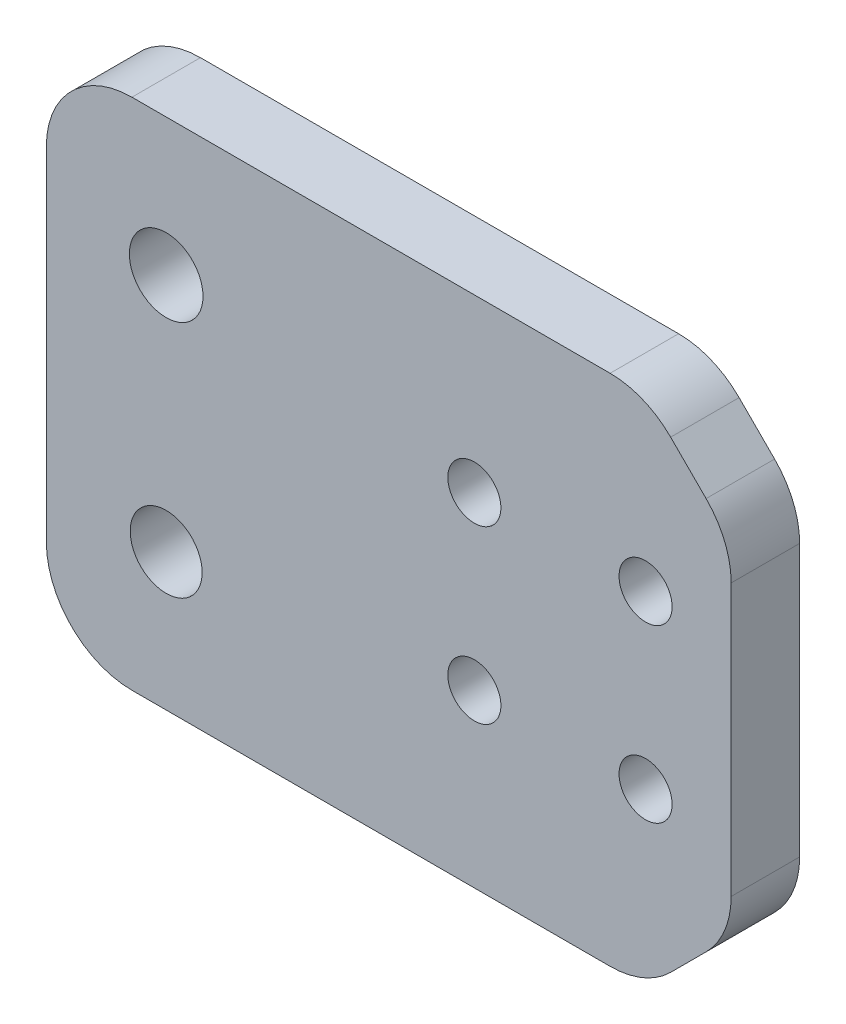
ISO-10303-21;
HEADER;
FILE_DESCRIPTION(('STEP AP214'),'2;1');
FILE_NAME('part.step','',(''),(''),'','','');
FILE_SCHEMA(('AUTOMOTIVE_DESIGN { 1 0 10303 214 1 1 1 1 }'));
ENDSEC;
DATA;
#1=APPLICATION_CONTEXT('core data for automotive mechanical design processes');
#2=APPLICATION_PROTOCOL_DEFINITION('international standard','automotive_design',2000,#1);
#3=PRODUCT_CONTEXT('',#1,'mechanical');
#4=PRODUCT('Part','Part','',(#3));
#5=PRODUCT_RELATED_PRODUCT_CATEGORY('part','',(#4));
#6=PRODUCT_DEFINITION_FORMATION('','',#4);
#7=PRODUCT_DEFINITION_CONTEXT('part definition',#1,'design');
#8=PRODUCT_DEFINITION('design','',#6,#7);
#9=PRODUCT_DEFINITION_SHAPE('','',#8);
#10=(LENGTH_UNIT() NAMED_UNIT(*) SI_UNIT(.MILLI.,.METRE.));
#11=(NAMED_UNIT(*) PLANE_ANGLE_UNIT() SI_UNIT($,.RADIAN.));
#12=(NAMED_UNIT(*) SI_UNIT($,.STERADIAN.) SOLID_ANGLE_UNIT());
#13=UNCERTAINTY_MEASURE_WITH_UNIT(LENGTH_MEASURE(1.E-05),#10,'distance_accuracy_value','');
#14=(GEOMETRIC_REPRESENTATION_CONTEXT(3) GLOBAL_UNCERTAINTY_ASSIGNED_CONTEXT((#13)) GLOBAL_UNIT_ASSIGNED_CONTEXT((#10,
#11,#12)) REPRESENTATION_CONTEXT('',''));
#15=CARTESIAN_POINT('',(0.,0.,0.));
#16=DIRECTION('',(0.,0.,1.));
#17=DIRECTION('',(1.,0.,0.));
#18=AXIS2_PLACEMENT_3D('',#15,#16,#17);
#19=CARTESIAN_POINT('',(0.,0.,-4.));
#20=DIRECTION('',(0.,0.,1.));
#21=DIRECTION('',(-1.,0.,0.));
#22=AXIS2_PLACEMENT_3D('',#19,#20,#21);
#23=PLANE('',#22);
#24=DIRECTION('',(1.,0.,0.));
#25=VECTOR('',#24,1.);
#26=CARTESIAN_POINT('',(0.,0.,-4.));
#27=LINE('',#26,#25);
#28=CARTESIAN_POINT('',(5.,0.,-4.));
#29=VERTEX_POINT('',#28);
#30=CARTESIAN_POINT('',(32.9289321881345,0.,-4.));
#31=VERTEX_POINT('',#30);
#32=EDGE_CURVE('E203',#29,#31,#27,.T.);
#33=ORIENTED_EDGE('',*,*,#32,.F.);
#34=CARTESIAN_POINT('',(5.,5.,-4.));
#35=DIRECTION('',(0.,0.,-1.));
#36=DIRECTION('',(-1.,0.,0.));
#37=AXIS2_PLACEMENT_3D('',#34,#35,#36);
#38=CIRCLE('',#37,5.);
#39=CARTESIAN_POINT('',(0.,5.,-4.));
#40=VERTEX_POINT('',#39);
#41=EDGE_CURVE('E139',#40,#29,#38,.F.);
#42=ORIENTED_EDGE('',*,*,#41,.F.);
#43=DIRECTION('',(0.,-1.,0.));
#44=VECTOR('',#43,1.);
#45=CARTESIAN_POINT('',(0.,0.,-4.));
#46=LINE('',#45,#44);
#47=CARTESIAN_POINT('',(0.,25.,-4.));
#48=VERTEX_POINT('',#47);
#49=EDGE_CURVE('E201',#48,#40,#46,.T.);
#50=ORIENTED_EDGE('',*,*,#49,.F.);
#51=CARTESIAN_POINT('',(5.,25.,-4.));
#52=DIRECTION('',(0.,0.,-1.));
#53=DIRECTION('',(-1.,0.,0.));
#54=AXIS2_PLACEMENT_3D('',#51,#52,#53);
#55=CIRCLE('',#54,5.);
#56=CARTESIAN_POINT('',(5.,30.,-4.));
#57=VERTEX_POINT('',#56);
#58=EDGE_CURVE('E189',#57,#48,#55,.F.);
#59=ORIENTED_EDGE('',*,*,#58,.F.);
#60=DIRECTION('',(-1.,0.,0.));
#61=VECTOR('',#60,1.);
#62=CARTESIAN_POINT('',(0.,30.,-4.));
#63=LINE('',#62,#61);
#64=CARTESIAN_POINT('',(32.9289321881345,30.,-4.));
#65=VERTEX_POINT('',#64);
#66=EDGE_CURVE('E211',#65,#57,#63,.T.);
#67=ORIENTED_EDGE('',*,*,#66,.F.);
#68=CARTESIAN_POINT('',(32.9289321881345,25.,-4.));
#69=DIRECTION('',(0.,0.,-1.));
#70=DIRECTION('',(-1.,0.,0.));
#71=AXIS2_PLACEMENT_3D('',#68,#69,#70);
#72=CIRCLE('',#71,5.);
#73=CARTESIAN_POINT('',(36.4644660940673,28.5355339059327,-4.));
#74=VERTEX_POINT('',#73);
#75=EDGE_CURVE('E221',#74,#65,#72,.F.);
#76=ORIENTED_EDGE('',*,*,#75,.F.);
#77=DIRECTION('',(0.707106781186546,-0.70710678118655,0.));
#78=VECTOR('',#77,1.);
#79=CARTESIAN_POINT('',(35.,30.,-4.));
#80=LINE('',#79,#78);
#81=CARTESIAN_POINT('',(38.5355339059328,26.4644660940672,-4.));
#82=VERTEX_POINT('',#81);
#83=EDGE_CURVE('E214',#82,#74,#80,.F.);
#84=ORIENTED_EDGE('',*,*,#83,.F.);
#85=CARTESIAN_POINT('',(35.,22.9289321881345,-4.));
#86=DIRECTION('',(0.,0.,-1.));
#87=DIRECTION('',(-1.,0.,0.));
#88=AXIS2_PLACEMENT_3D('',#85,#86,#87);
#89=CIRCLE('',#88,5.);
#90=CARTESIAN_POINT('',(40.,22.9289321881345,-4.));
#91=VERTEX_POINT('',#90);
#92=EDGE_CURVE('E224',#91,#82,#89,.F.);
#93=ORIENTED_EDGE('',*,*,#92,.F.);
#94=DIRECTION('',(0.,1.,0.));
#95=VECTOR('',#94,1.);
#96=CARTESIAN_POINT('',(40.,0.,-4.));
#97=LINE('',#96,#95);
#98=CARTESIAN_POINT('',(40.,7.07106781186549,-4.));
#99=VERTEX_POINT('',#98);
#100=EDGE_CURVE('E249',#99,#91,#97,.T.);
#101=ORIENTED_EDGE('',*,*,#100,.F.);
#102=CARTESIAN_POINT('',(35.,7.07106781186549,-4.));
#103=DIRECTION('',(0.,0.,-1.));
#104=DIRECTION('',(-1.,0.,0.));
#105=AXIS2_PLACEMENT_3D('',#102,#103,#104);
#106=CIRCLE('',#105,5.);
#107=CARTESIAN_POINT('',(38.5355339059327,3.53553390593274,-4.));
#108=VERTEX_POINT('',#107);
#109=EDGE_CURVE('E226',#108,#99,#106,.F.);
#110=ORIENTED_EDGE('',*,*,#109,.F.);
#111=DIRECTION('',(-0.707106781186549,-0.707106781186547,0.));
#112=VECTOR('',#111,1.);
#113=CARTESIAN_POINT('',(40.,5.,-4.));
#114=LINE('',#113,#112);
#115=CARTESIAN_POINT('',(36.4644660940672,1.46446609406726,-4.));
#116=VERTEX_POINT('',#115);
#117=EDGE_CURVE('E144',#116,#108,#114,.F.);
#118=ORIENTED_EDGE('',*,*,#117,.F.);
#119=CARTESIAN_POINT('',(32.9289321881345,5.,-4.));
#120=DIRECTION('',(0.,0.,-1.));
#121=DIRECTION('',(-1.,0.,0.));
#122=AXIS2_PLACEMENT_3D('',#119,#120,#121);
#123=CIRCLE('',#122,5.);
#124=EDGE_CURVE('E229',#31,#116,#123,.F.);
#125=ORIENTED_EDGE('',*,*,#124,.F.);
#126=EDGE_LOOP('',(#33,#42,#50,#59,#67,#76,#84,#93,#101,#110,#118,#125));
#127=FACE_BOUND('',#126,.T.);
#128=CARTESIAN_POINT('',(7.,22.,-4.));
#129=DIRECTION('',(0.,0.,1.));
#130=DIRECTION('',(1.,0.,0.));
#131=AXIS2_PLACEMENT_3D('',#128,#129,#130);
#132=CIRCLE('',#131,2.14999999999999);
#133=CARTESIAN_POINT('',(9.14999999999999,22.,-4.));
#134=VERTEX_POINT('',#133);
#135=EDGE_CURVE('E194',#134,#134,#132,.T.);
#136=ORIENTED_EDGE('',*,*,#135,.T.);
#137=EDGE_LOOP('',(#136));
#138=FACE_BOUND('',#137,.T.);
#139=CARTESIAN_POINT('',(7.,8.00000000000005,-4.));
#140=DIRECTION('',(0.,0.,1.));
#141=DIRECTION('',(1.,0.,0.));
#142=AXIS2_PLACEMENT_3D('',#139,#140,#141);
#143=CIRCLE('',#142,2.09999999999999);
#144=CARTESIAN_POINT('',(9.09999999999999,8.00000000000005,-4.));
#145=VERTEX_POINT('',#144);
#146=EDGE_CURVE('E436',#145,#145,#143,.T.);
#147=ORIENTED_EDGE('',*,*,#146,.T.);
#148=EDGE_LOOP('',(#147));
#149=FACE_BOUND('',#148,.T.);
#150=CARTESIAN_POINT('',(35.,20.,-4.));
#151=DIRECTION('',(0.,0.,1.));
#152=DIRECTION('',(1.,0.,0.));
#153=AXIS2_PLACEMENT_3D('',#150,#151,#152);
#154=CIRCLE('',#153,1.54999999999999);
#155=CARTESIAN_POINT('',(36.55,20.,-4.));
#156=VERTEX_POINT('',#155);
#157=EDGE_CURVE('E451',#156,#156,#154,.T.);
#158=ORIENTED_EDGE('',*,*,#157,.T.);
#159=EDGE_LOOP('',(#158));
#160=FACE_BOUND('',#159,.T.);
#161=CARTESIAN_POINT('',(25.,19.9999999999999,-4.));
#162=DIRECTION('',(0.,0.,1.));
#163=DIRECTION('',(1.,0.,0.));
#164=AXIS2_PLACEMENT_3D('',#161,#162,#163);
#165=CIRCLE('',#164,1.54999999999999);
#166=CARTESIAN_POINT('',(26.55,19.9999999999999,-4.));
#167=VERTEX_POINT('',#166);
#168=EDGE_CURVE('E456',#167,#167,#165,.T.);
#169=ORIENTED_EDGE('',*,*,#168,.T.);
#170=EDGE_LOOP('',(#169));
#171=FACE_BOUND('',#170,.T.);
#172=CARTESIAN_POINT('',(25.0000000000001,9.99999999999993,-4.));
#173=DIRECTION('',(0.,0.,1.));
#174=DIRECTION('',(1.,0.,0.));
#175=AXIS2_PLACEMENT_3D('',#172,#173,#174);
#176=CIRCLE('',#175,1.54999999999999);
#177=CARTESIAN_POINT('',(26.5500000000001,9.99999999999993,-4.));
#178=VERTEX_POINT('',#177);
#179=EDGE_CURVE('E462',#178,#178,#176,.T.);
#180=ORIENTED_EDGE('',*,*,#179,.T.);
#181=EDGE_LOOP('',(#180));
#182=FACE_BOUND('',#181,.T.);
#183=CARTESIAN_POINT('',(35.0000000000001,10.,-4.));
#184=DIRECTION('',(0.,0.,1.));
#185=DIRECTION('',(1.,0.,0.));
#186=AXIS2_PLACEMENT_3D('',#183,#184,#185);
#187=CIRCLE('',#186,1.54999999999999);
#188=CARTESIAN_POINT('',(36.5500000000001,10.,-4.));
#189=VERTEX_POINT('',#188);
#190=EDGE_CURVE('E468',#189,#189,#187,.T.);
#191=ORIENTED_EDGE('',*,*,#190,.T.);
#192=EDGE_LOOP('',(#191));
#193=FACE_BOUND('',#192,.T.);
#194=ADVANCED_FACE('F43',(#127,#138,#149,#160,#171,#182,#193),#23,.F.);
#195=CARTESIAN_POINT('',(0.,0.,0.));
#196=DIRECTION('',(0.,0.,1.));
#197=DIRECTION('',(-1.,0.,0.));
#198=AXIS2_PLACEMENT_3D('',#195,#196,#197);
#199=PLANE('',#198);
#200=CARTESIAN_POINT('',(25.0000000000001,9.99999999999993,0.));
#201=DIRECTION('',(0.,0.,1.));
#202=DIRECTION('',(1.,0.,0.));
#203=AXIS2_PLACEMENT_3D('',#200,#201,#202);
#204=CIRCLE('',#203,1.54999999999999);
#205=CARTESIAN_POINT('',(26.5500000000001,9.99999999999993,0.));
#206=VERTEX_POINT('',#205);
#207=EDGE_CURVE('E465',#206,#206,#204,.T.);
#208=ORIENTED_EDGE('',*,*,#207,.F.);
#209=EDGE_LOOP('',(#208));
#210=FACE_BOUND('',#209,.T.);
#211=CARTESIAN_POINT('',(35.,20.,0.));
#212=DIRECTION('',(0.,0.,1.));
#213=DIRECTION('',(1.,0.,0.));
#214=AXIS2_PLACEMENT_3D('',#211,#212,#213);
#215=CIRCLE('',#214,1.54999999999999);
#216=CARTESIAN_POINT('',(36.55,20.,0.));
#217=VERTEX_POINT('',#216);
#218=EDGE_CURVE('E453',#217,#217,#215,.T.);
#219=ORIENTED_EDGE('',*,*,#218,.F.);
#220=EDGE_LOOP('',(#219));
#221=FACE_BOUND('',#220,.T.);
#222=CARTESIAN_POINT('',(7.,22.,0.));
#223=DIRECTION('',(0.,0.,1.));
#224=DIRECTION('',(1.,0.,0.));
#225=AXIS2_PLACEMENT_3D('',#222,#223,#224);
#226=CIRCLE('',#225,2.14999999999999);
#227=CARTESIAN_POINT('',(9.14999999999999,22.,0.));
#228=VERTEX_POINT('',#227);
#229=EDGE_CURVE('E434',#228,#228,#226,.T.);
#230=ORIENTED_EDGE('',*,*,#229,.F.);
#231=EDGE_LOOP('',(#230));
#232=FACE_BOUND('',#231,.T.);
#233=DIRECTION('',(0.707106781186549,0.707106781186547,0.));
#234=VECTOR('',#233,1.);
#235=CARTESIAN_POINT('',(17.4999999999999,-17.5,0.));
#236=LINE('',#235,#234);
#237=CARTESIAN_POINT('',(38.5355339059327,3.53553390593274,0.));
#238=VERTEX_POINT('',#237);
#239=CARTESIAN_POINT('',(36.4644660940673,1.46446609406726,0.));
#240=VERTEX_POINT('',#239);
#241=EDGE_CURVE('E210',#238,#240,#236,.F.);
#242=ORIENTED_EDGE('',*,*,#241,.F.);
#243=CARTESIAN_POINT('',(35.,7.07106781186549,0.));
#244=DIRECTION('',(0.,0.,-1.));
#245=DIRECTION('',(-1.,0.,0.));
#246=AXIS2_PLACEMENT_3D('',#243,#244,#245);
#247=CIRCLE('',#246,5.);
#248=CARTESIAN_POINT('',(40.,7.07106781186549,0.));
#249=VERTEX_POINT('',#248);
#250=EDGE_CURVE('E171',#249,#238,#247,.T.);
#251=ORIENTED_EDGE('',*,*,#250,.F.);
#252=DIRECTION('',(0.,1.,0.));
#253=VECTOR('',#252,1.);
#254=CARTESIAN_POINT('',(40.,0.,0.));
#255=LINE('',#254,#253);
#256=CARTESIAN_POINT('',(40.,22.9289321881345,0.));
#257=VERTEX_POINT('',#256);
#258=EDGE_CURVE('E152',#249,#257,#255,.T.);
#259=ORIENTED_EDGE('',*,*,#258,.T.);
#260=CARTESIAN_POINT('',(35.,22.9289321881345,0.));
#261=DIRECTION('',(0.,0.,-1.));
#262=DIRECTION('',(-1.,0.,0.));
#263=AXIS2_PLACEMENT_3D('',#260,#261,#262);
#264=CIRCLE('',#263,5.);
#265=CARTESIAN_POINT('',(38.5355339059328,26.4644660940672,0.));
#266=VERTEX_POINT('',#265);
#267=EDGE_CURVE('E163',#266,#257,#264,.T.);
#268=ORIENTED_EDGE('',*,*,#267,.F.);
#269=DIRECTION('',(-0.707106781186546,0.70710678118655,0.));
#270=VECTOR('',#269,1.);
#271=CARTESIAN_POINT('',(32.5000000000001,32.4999999999999,0.));
#272=LINE('',#271,#270);
#273=CARTESIAN_POINT('',(36.4644660940673,28.5355339059327,0.));
#274=VERTEX_POINT('',#273);
#275=EDGE_CURVE('E208',#274,#266,#272,.F.);
#276=ORIENTED_EDGE('',*,*,#275,.F.);
#277=CARTESIAN_POINT('',(32.9289321881345,25.,0.));
#278=DIRECTION('',(0.,0.,-1.));
#279=DIRECTION('',(-1.,0.,0.));
#280=AXIS2_PLACEMENT_3D('',#277,#278,#279);
#281=CIRCLE('',#280,5.);
#282=CARTESIAN_POINT('',(32.9289321881345,30.,0.));
#283=VERTEX_POINT('',#282);
#284=EDGE_CURVE('E160',#283,#274,#281,.T.);
#285=ORIENTED_EDGE('',*,*,#284,.F.);
#286=DIRECTION('',(-1.,0.,0.));
#287=VECTOR('',#286,1.);
#288=CARTESIAN_POINT('',(0.,30.,0.));
#289=LINE('',#288,#287);
#290=CARTESIAN_POINT('',(5.,30.,0.));
#291=VERTEX_POINT('',#290);
#292=EDGE_CURVE('E198',#283,#291,#289,.T.);
#293=ORIENTED_EDGE('',*,*,#292,.T.);
#294=CARTESIAN_POINT('',(5.,25.,0.));
#295=DIRECTION('',(0.,0.,-1.));
#296=DIRECTION('',(-1.,0.,0.));
#297=AXIS2_PLACEMENT_3D('',#294,#295,#296);
#298=CIRCLE('',#297,5.);
#299=CARTESIAN_POINT('',(0.,25.,0.));
#300=VERTEX_POINT('',#299);
#301=EDGE_CURVE('E161',#300,#291,#298,.T.);
#302=ORIENTED_EDGE('',*,*,#301,.F.);
#303=DIRECTION('',(0.,-1.,0.));
#304=VECTOR('',#303,1.);
#305=CARTESIAN_POINT('',(0.,0.,0.));
#306=LINE('',#305,#304);
#307=CARTESIAN_POINT('',(0.,5.,0.));
#308=VERTEX_POINT('',#307);
#309=EDGE_CURVE('E153',#300,#308,#306,.T.);
#310=ORIENTED_EDGE('',*,*,#309,.T.);
#311=CARTESIAN_POINT('',(5.,5.,0.));
#312=DIRECTION('',(0.,0.,-1.));
#313=DIRECTION('',(-1.,0.,0.));
#314=AXIS2_PLACEMENT_3D('',#311,#312,#313);
#315=CIRCLE('',#314,5.);
#316=CARTESIAN_POINT('',(5.,0.,0.));
#317=VERTEX_POINT('',#316);
#318=EDGE_CURVE('E136',#317,#308,#315,.T.);
#319=ORIENTED_EDGE('',*,*,#318,.F.);
#320=DIRECTION('',(1.,0.,0.));
#321=VECTOR('',#320,1.);
#322=CARTESIAN_POINT('',(0.,0.,0.));
#323=LINE('',#322,#321);
#324=CARTESIAN_POINT('',(32.9289321881345,0.,0.));
#325=VERTEX_POINT('',#324);
#326=EDGE_CURVE('E147',#317,#325,#323,.T.);
#327=ORIENTED_EDGE('',*,*,#326,.T.);
#328=CARTESIAN_POINT('',(32.9289321881345,5.,0.));
#329=DIRECTION('',(0.,0.,-1.));
#330=DIRECTION('',(-1.,0.,0.));
#331=AXIS2_PLACEMENT_3D('',#328,#329,#330);
#332=CIRCLE('',#331,5.);
#333=EDGE_CURVE('E174',#240,#325,#332,.T.);
#334=ORIENTED_EDGE('',*,*,#333,.F.);
#335=EDGE_LOOP('',(#242,#251,#259,#268,#276,#285,#293,#302,#310,#319,#327,#334));
#336=FACE_BOUND('',#335,.T.);
#337=CARTESIAN_POINT('',(7.,8.00000000000005,0.));
#338=DIRECTION('',(0.,0.,1.));
#339=DIRECTION('',(1.,0.,0.));
#340=AXIS2_PLACEMENT_3D('',#337,#338,#339);
#341=CIRCLE('',#340,2.09999999999999);
#342=CARTESIAN_POINT('',(9.09999999999999,8.00000000000005,0.));
#343=VERTEX_POINT('',#342);
#344=EDGE_CURVE('E440',#343,#343,#341,.T.);
#345=ORIENTED_EDGE('',*,*,#344,.F.);
#346=EDGE_LOOP('',(#345));
#347=FACE_BOUND('',#346,.T.);
#348=CARTESIAN_POINT('',(25.,19.9999999999999,0.));
#349=DIRECTION('',(0.,0.,1.));
#350=DIRECTION('',(1.,0.,0.));
#351=AXIS2_PLACEMENT_3D('',#348,#349,#350);
#352=CIRCLE('',#351,1.54999999999999);
#353=CARTESIAN_POINT('',(26.55,19.9999999999999,0.));
#354=VERTEX_POINT('',#353);
#355=EDGE_CURVE('E459',#354,#354,#352,.T.);
#356=ORIENTED_EDGE('',*,*,#355,.F.);
#357=EDGE_LOOP('',(#356));
#358=FACE_BOUND('',#357,.T.);
#359=CARTESIAN_POINT('',(35.0000000000001,10.,0.));
#360=DIRECTION('',(0.,0.,1.));
#361=DIRECTION('',(1.,0.,0.));
#362=AXIS2_PLACEMENT_3D('',#359,#360,#361);
#363=CIRCLE('',#362,1.54999999999999);
#364=CARTESIAN_POINT('',(36.5500000000001,10.,0.));
#365=VERTEX_POINT('',#364);
#366=EDGE_CURVE('E471',#365,#365,#363,.T.);
#367=ORIENTED_EDGE('',*,*,#366,.F.);
#368=EDGE_LOOP('',(#367));
#369=FACE_BOUND('',#368,.T.);
#370=ADVANCED_FACE('F156',(#210,#221,#232,#336,#347,#358,#369),#199,.T.);
#371=CARTESIAN_POINT('',(0.,0.,-4.));
#372=DIRECTION('',(1.,0.,0.));
#373=DIRECTION('',(0.,0.,1.));
#374=AXIS2_PLACEMENT_3D('',#371,#372,#373);
#375=PLANE('',#374);
#376=ORIENTED_EDGE('',*,*,#309,.F.);
#377=DIRECTION('',(0.,0.,1.));
#378=VECTOR('',#377,1.);
#379=CARTESIAN_POINT('',(0.,25.,-4.));
#380=LINE('',#379,#378);
#381=EDGE_CURVE('E51',#48,#300,#380,.T.);
#382=ORIENTED_EDGE('',*,*,#381,.F.);
#383=ORIENTED_EDGE('',*,*,#49,.T.);
#384=DIRECTION('',(0.,0.,1.));
#385=VECTOR('',#384,1.);
#386=CARTESIAN_POINT('',(0.,5.,-4.));
#387=LINE('',#386,#385);
#388=EDGE_CURVE('E11',#308,#40,#387,.F.);
#389=ORIENTED_EDGE('',*,*,#388,.F.);
#390=EDGE_LOOP('',(#376,#382,#383,#389));
#391=FACE_BOUND('',#390,.T.);
#392=ADVANCED_FACE('F193',(#391),#375,.F.);
#393=CARTESIAN_POINT('',(0.,0.,-4.));
#394=DIRECTION('',(0.,1.,0.));
#395=DIRECTION('',(0.,0.,-1.));
#396=AXIS2_PLACEMENT_3D('',#393,#394,#395);
#397=PLANE('',#396);
#398=ORIENTED_EDGE('',*,*,#326,.F.);
#399=DIRECTION('',(0.,0.,1.));
#400=VECTOR('',#399,1.);
#401=CARTESIAN_POINT('',(5.,0.,-4.));
#402=LINE('',#401,#400);
#403=EDGE_CURVE('E132',#29,#317,#402,.T.);
#404=ORIENTED_EDGE('',*,*,#403,.F.);
#405=ORIENTED_EDGE('',*,*,#32,.T.);
#406=DIRECTION('',(0.,0.,1.));
#407=VECTOR('',#406,1.);
#408=CARTESIAN_POINT('',(32.9289321881345,0.,-4.));
#409=LINE('',#408,#407);
#410=EDGE_CURVE('E143',#325,#31,#409,.F.);
#411=ORIENTED_EDGE('',*,*,#410,.F.);
#412=EDGE_LOOP('',(#398,#404,#405,#411));
#413=FACE_BOUND('',#412,.T.);
#414=ADVANCED_FACE('F148',(#413),#397,.F.);
#415=CARTESIAN_POINT('',(40.,0.,-4.));
#416=DIRECTION('',(-1.,0.,0.));
#417=DIRECTION('',(0.,0.,-1.));
#418=AXIS2_PLACEMENT_3D('',#415,#416,#417);
#419=PLANE('',#418);
#420=ORIENTED_EDGE('',*,*,#100,.T.);
#421=DIRECTION('',(0.,0.,1.));
#422=VECTOR('',#421,1.);
#423=CARTESIAN_POINT('',(40.,22.9289321881345,-4.));
#424=LINE('',#423,#422);
#425=EDGE_CURVE('E176',#257,#91,#424,.F.);
#426=ORIENTED_EDGE('',*,*,#425,.F.);
#427=ORIENTED_EDGE('',*,*,#258,.F.);
#428=DIRECTION('',(0.,0.,-1.));
#429=VECTOR('',#428,1.);
#430=CARTESIAN_POINT('',(40.,7.07106781186549,0.));
#431=LINE('',#430,#429);
#432=EDGE_CURVE('E178',#99,#249,#431,.F.);
#433=ORIENTED_EDGE('',*,*,#432,.F.);
#434=EDGE_LOOP('',(#420,#426,#427,#433));
#435=FACE_BOUND('',#434,.T.);
#436=ADVANCED_FACE('F247',(#435),#419,.F.);
#437=CARTESIAN_POINT('',(0.,30.,-4.));
#438=DIRECTION('',(0.,-1.,0.));
#439=DIRECTION('',(0.,0.,1.));
#440=AXIS2_PLACEMENT_3D('',#437,#438,#439);
#441=PLANE('',#440);
#442=ORIENTED_EDGE('',*,*,#66,.T.);
#443=DIRECTION('',(0.,0.,1.));
#444=VECTOR('',#443,1.);
#445=CARTESIAN_POINT('',(5.,30.,-4.));
#446=LINE('',#445,#444);
#447=EDGE_CURVE('E182',#291,#57,#446,.F.);
#448=ORIENTED_EDGE('',*,*,#447,.F.);
#449=ORIENTED_EDGE('',*,*,#292,.F.);
#450=DIRECTION('',(0.,0.,-1.));
#451=VECTOR('',#450,1.);
#452=CARTESIAN_POINT('',(32.9289321881345,30.,0.));
#453=LINE('',#452,#451);
#454=EDGE_CURVE('E184',#65,#283,#453,.F.);
#455=ORIENTED_EDGE('',*,*,#454,.F.);
#456=EDGE_LOOP('',(#442,#448,#449,#455));
#457=FACE_BOUND('',#456,.T.);
#458=ADVANCED_FACE('F275',(#457),#441,.F.);
#459=CARTESIAN_POINT('',(7.,22.,-4.));
#460=DIRECTION('',(0.,0.,1.));
#461=DIRECTION('',(-1.,0.,0.));
#462=AXIS2_PLACEMENT_3D('',#459,#460,#461);
#463=CYLINDRICAL_SURFACE('',#462,2.14999999999999);
#464=ORIENTED_EDGE('',*,*,#135,.F.);
#465=EDGE_LOOP('',(#464));
#466=FACE_BOUND('',#465,.T.);
#467=ORIENTED_EDGE('',*,*,#229,.T.);
#468=EDGE_LOOP('',(#467));
#469=FACE_BOUND('',#468,.T.);
#470=ADVANCED_FACE('F272',(#466,#469),#463,.F.);
#471=CARTESIAN_POINT('',(7.,8.00000000000005,-4.));
#472=DIRECTION('',(0.,0.,1.));
#473=DIRECTION('',(-1.,0.,0.));
#474=AXIS2_PLACEMENT_3D('',#471,#472,#473);
#475=CYLINDRICAL_SURFACE('',#474,2.09999999999999);
#476=ORIENTED_EDGE('',*,*,#146,.F.);
#477=EDGE_LOOP('',(#476));
#478=FACE_BOUND('',#477,.T.);
#479=ORIENTED_EDGE('',*,*,#344,.T.);
#480=EDGE_LOOP('',(#479));
#481=FACE_BOUND('',#480,.T.);
#482=ADVANCED_FACE('F361',(#478,#481),#475,.F.);
#483=CARTESIAN_POINT('',(35.,20.,-4.));
#484=DIRECTION('',(0.,0.,1.));
#485=DIRECTION('',(-1.,0.,0.));
#486=AXIS2_PLACEMENT_3D('',#483,#484,#485);
#487=CYLINDRICAL_SURFACE('',#486,1.54999999999999);
#488=ORIENTED_EDGE('',*,*,#157,.F.);
#489=EDGE_LOOP('',(#488));
#490=FACE_BOUND('',#489,.T.);
#491=ORIENTED_EDGE('',*,*,#218,.T.);
#492=EDGE_LOOP('',(#491));
#493=FACE_BOUND('',#492,.T.);
#494=ADVANCED_FACE('F352',(#490,#493),#487,.F.);
#495=CARTESIAN_POINT('',(25.,19.9999999999999,-4.));
#496=DIRECTION('',(0.,0.,1.));
#497=DIRECTION('',(-1.,0.,0.));
#498=AXIS2_PLACEMENT_3D('',#495,#496,#497);
#499=CYLINDRICAL_SURFACE('',#498,1.54999999999999);
#500=ORIENTED_EDGE('',*,*,#168,.F.);
#501=EDGE_LOOP('',(#500));
#502=FACE_BOUND('',#501,.T.);
#503=ORIENTED_EDGE('',*,*,#355,.T.);
#504=EDGE_LOOP('',(#503));
#505=FACE_BOUND('',#504,.T.);
#506=ADVANCED_FACE('F343',(#502,#505),#499,.F.);
#507=CARTESIAN_POINT('',(25.0000000000001,9.99999999999993,-4.));
#508=DIRECTION('',(0.,0.,1.));
#509=DIRECTION('',(-1.,0.,0.));
#510=AXIS2_PLACEMENT_3D('',#507,#508,#509);
#511=CYLINDRICAL_SURFACE('',#510,1.54999999999999);
#512=ORIENTED_EDGE('',*,*,#179,.F.);
#513=EDGE_LOOP('',(#512));
#514=FACE_BOUND('',#513,.T.);
#515=ORIENTED_EDGE('',*,*,#207,.T.);
#516=EDGE_LOOP('',(#515));
#517=FACE_BOUND('',#516,.T.);
#518=ADVANCED_FACE('F333',(#514,#517),#511,.F.);
#519=CARTESIAN_POINT('',(35.0000000000001,10.,-4.));
#520=DIRECTION('',(0.,0.,1.));
#521=DIRECTION('',(-1.,0.,0.));
#522=AXIS2_PLACEMENT_3D('',#519,#520,#521);
#523=CYLINDRICAL_SURFACE('',#522,1.54999999999999);
#524=ORIENTED_EDGE('',*,*,#190,.F.);
#525=EDGE_LOOP('',(#524));
#526=FACE_BOUND('',#525,.T.);
#527=ORIENTED_EDGE('',*,*,#366,.T.);
#528=EDGE_LOOP('',(#527));
#529=FACE_BOUND('',#528,.T.);
#530=ADVANCED_FACE('F287',(#526,#529),#523,.F.);
#531=CARTESIAN_POINT('',(40.,5.,-4.));
#532=DIRECTION('',(-0.707106781186547,0.707106781186549,0.));
#533=DIRECTION('',(0.,0.,1.));
#534=AXIS2_PLACEMENT_3D('',#531,#532,#533);
#535=PLANE('',#534);
#536=ORIENTED_EDGE('',*,*,#117,.T.);
#537=DIRECTION('',(0.,0.,1.));
#538=VECTOR('',#537,1.);
#539=CARTESIAN_POINT('',(38.5355339059327,3.53553390593274,-4.));
#540=LINE('',#539,#538);
#541=EDGE_CURVE('E232',#238,#108,#540,.F.);
#542=ORIENTED_EDGE('',*,*,#541,.F.);
#543=ORIENTED_EDGE('',*,*,#241,.T.);
#544=DIRECTION('',(0.,0.,-1.));
#545=VECTOR('',#544,1.);
#546=CARTESIAN_POINT('',(36.4644660940672,1.46446609406726,0.));
#547=LINE('',#546,#545);
#548=EDGE_CURVE('E166',#116,#240,#547,.F.);
#549=ORIENTED_EDGE('',*,*,#548,.F.);
#550=EDGE_LOOP('',(#536,#542,#543,#549));
#551=FACE_BOUND('',#550,.T.);
#552=ADVANCED_FACE('F239',(#551),#535,.F.);
#553=CARTESIAN_POINT('',(35.,30.,-4.));
#554=DIRECTION('',(-0.70710678118655,-0.707106781186546,0.));
#555=DIRECTION('',(0.,0.,1.));
#556=AXIS2_PLACEMENT_3D('',#553,#554,#555);
#557=PLANE('',#556);
#558=ORIENTED_EDGE('',*,*,#83,.T.);
#559=DIRECTION('',(0.,0.,1.));
#560=VECTOR('',#559,1.);
#561=CARTESIAN_POINT('',(36.4644660940673,28.5355339059327,-4.));
#562=LINE('',#561,#560);
#563=EDGE_CURVE('E65',#274,#74,#562,.F.);
#564=ORIENTED_EDGE('',*,*,#563,.F.);
#565=ORIENTED_EDGE('',*,*,#275,.T.);
#566=DIRECTION('',(0.,0.,-1.));
#567=VECTOR('',#566,1.);
#568=CARTESIAN_POINT('',(38.5355339059328,26.4644660940672,0.));
#569=LINE('',#568,#567);
#570=EDGE_CURVE('E58',#82,#266,#569,.F.);
#571=ORIENTED_EDGE('',*,*,#570,.F.);
#572=EDGE_LOOP('',(#558,#564,#565,#571));
#573=FACE_BOUND('',#572,.T.);
#574=ADVANCED_FACE('F286',(#573),#557,.F.);
#575=CARTESIAN_POINT('',(32.9289321881345,5.,-4.));
#576=DIRECTION('',(0.,0.,-1.));
#577=DIRECTION('',(1.,0.,0.));
#578=AXIS2_PLACEMENT_3D('',#575,#576,#577);
#579=CYLINDRICAL_SURFACE('',#578,5.);
#580=ORIENTED_EDGE('',*,*,#333,.T.);
#581=ORIENTED_EDGE('',*,*,#410,.T.);
#582=ORIENTED_EDGE('',*,*,#124,.T.);
#583=ORIENTED_EDGE('',*,*,#548,.T.);
#584=EDGE_LOOP('',(#580,#581,#582,#583));
#585=FACE_BOUND('',#584,.T.);
#586=ADVANCED_FACE('F234',(#585),#579,.T.);
#587=CARTESIAN_POINT('',(35.,7.07106781186549,-4.));
#588=DIRECTION('',(0.,0.,1.));
#589=DIRECTION('',(-1.,0.,0.));
#590=AXIS2_PLACEMENT_3D('',#587,#588,#589);
#591=CYLINDRICAL_SURFACE('',#590,5.);
#592=ORIENTED_EDGE('',*,*,#109,.T.);
#593=ORIENTED_EDGE('',*,*,#432,.T.);
#594=ORIENTED_EDGE('',*,*,#250,.T.);
#595=ORIENTED_EDGE('',*,*,#541,.T.);
#596=EDGE_LOOP('',(#592,#593,#594,#595));
#597=FACE_BOUND('',#596,.T.);
#598=ADVANCED_FACE('F242',(#597),#591,.T.);
#599=CARTESIAN_POINT('',(35.,22.9289321881345,-4.));
#600=DIRECTION('',(0.,0.,-1.));
#601=DIRECTION('',(1.,0.,0.));
#602=AXIS2_PLACEMENT_3D('',#599,#600,#601);
#603=CYLINDRICAL_SURFACE('',#602,5.);
#604=ORIENTED_EDGE('',*,*,#267,.T.);
#605=ORIENTED_EDGE('',*,*,#425,.T.);
#606=ORIENTED_EDGE('',*,*,#92,.T.);
#607=ORIENTED_EDGE('',*,*,#570,.T.);
#608=EDGE_LOOP('',(#604,#605,#606,#607));
#609=FACE_BOUND('',#608,.T.);
#610=ADVANCED_FACE('F251',(#609),#603,.T.);
#611=CARTESIAN_POINT('',(32.9289321881345,25.,-4.));
#612=DIRECTION('',(0.,0.,1.));
#613=DIRECTION('',(-1.,0.,0.));
#614=AXIS2_PLACEMENT_3D('',#611,#612,#613);
#615=CYLINDRICAL_SURFACE('',#614,5.);
#616=ORIENTED_EDGE('',*,*,#75,.T.);
#617=ORIENTED_EDGE('',*,*,#454,.T.);
#618=ORIENTED_EDGE('',*,*,#284,.T.);
#619=ORIENTED_EDGE('',*,*,#563,.T.);
#620=EDGE_LOOP('',(#616,#617,#618,#619));
#621=FACE_BOUND('',#620,.T.);
#622=ADVANCED_FACE('F253',(#621),#615,.T.);
#623=CARTESIAN_POINT('',(5.,5.,-4.));
#624=DIRECTION('',(0.,0.,1.));
#625=DIRECTION('',(-1.,0.,0.));
#626=AXIS2_PLACEMENT_3D('',#623,#624,#625);
#627=CYLINDRICAL_SURFACE('',#626,5.);
#628=ORIENTED_EDGE('',*,*,#41,.T.);
#629=ORIENTED_EDGE('',*,*,#403,.T.);
#630=ORIENTED_EDGE('',*,*,#318,.T.);
#631=ORIENTED_EDGE('',*,*,#388,.T.);
#632=EDGE_LOOP('',(#628,#629,#630,#631));
#633=FACE_BOUND('',#632,.T.);
#634=ADVANCED_FACE('F134',(#633),#627,.T.);
#635=CARTESIAN_POINT('',(5.,25.,-4.));
#636=DIRECTION('',(0.,0.,1.));
#637=DIRECTION('',(-1.,0.,0.));
#638=AXIS2_PLACEMENT_3D('',#635,#636,#637);
#639=CYLINDRICAL_SURFACE('',#638,5.);
#640=ORIENTED_EDGE('',*,*,#58,.T.);
#641=ORIENTED_EDGE('',*,*,#381,.T.);
#642=ORIENTED_EDGE('',*,*,#301,.T.);
#643=ORIENTED_EDGE('',*,*,#447,.T.);
#644=EDGE_LOOP('',(#640,#641,#642,#643));
#645=FACE_BOUND('',#644,.T.);
#646=ADVANCED_FACE('F45',(#645),#639,.T.);
#647=CLOSED_SHELL('',(#194,#370,#392,#414,#436,#458,#470,#482,#494,#506,#518,#530,#552,#574,
#586,#598,#610,#622,#634,#646));
#648=MANIFOLD_SOLID_BREP('B2',#647);
#649=ADVANCED_BREP_SHAPE_REPRESENTATION('',(#18,#648),#14);
#650=SHAPE_DEFINITION_REPRESENTATION(#9,#649);
ENDSEC;
END-ISO-10303-21;
